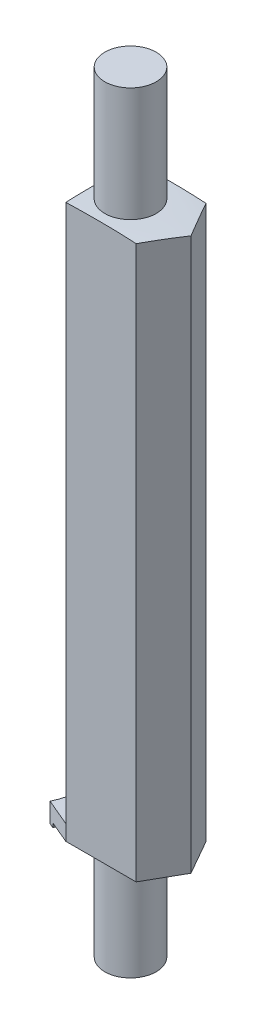
ISO-10303-21;
HEADER;
FILE_DESCRIPTION(('STEP AP214'),'2;1');
FILE_NAME('part.step','',(''),(''),'','','');
FILE_SCHEMA(('AUTOMOTIVE_DESIGN { 1 0 10303 214 1 1 1 1 }'));
ENDSEC;
DATA;
#1=APPLICATION_CONTEXT('core data for automotive mechanical design processes');
#2=APPLICATION_PROTOCOL_DEFINITION('international standard','automotive_design',2000,#1);
#3=PRODUCT_CONTEXT('',#1,'mechanical');
#4=PRODUCT('Part','Part','',(#3));
#5=PRODUCT_RELATED_PRODUCT_CATEGORY('part','',(#4));
#6=PRODUCT_DEFINITION_FORMATION('','',#4);
#7=PRODUCT_DEFINITION_CONTEXT('part definition',#1,'design');
#8=PRODUCT_DEFINITION('design','',#6,#7);
#9=PRODUCT_DEFINITION_SHAPE('','',#8);
#10=(LENGTH_UNIT() NAMED_UNIT(*) SI_UNIT(.MILLI.,.METRE.));
#11=(NAMED_UNIT(*) PLANE_ANGLE_UNIT() SI_UNIT($,.RADIAN.));
#12=(NAMED_UNIT(*) SI_UNIT($,.STERADIAN.) SOLID_ANGLE_UNIT());
#13=UNCERTAINTY_MEASURE_WITH_UNIT(LENGTH_MEASURE(1.E-05),#10,'distance_accuracy_value','');
#14=(GEOMETRIC_REPRESENTATION_CONTEXT(3) GLOBAL_UNCERTAINTY_ASSIGNED_CONTEXT((#13)) GLOBAL_UNIT_ASSIGNED_CONTEXT((#10,
#11,#12)) REPRESENTATION_CONTEXT('',''));
#15=CARTESIAN_POINT('',(0.,0.,0.));
#16=DIRECTION('',(0.,0.,1.));
#17=DIRECTION('',(1.,0.,0.));
#18=AXIS2_PLACEMENT_3D('',#15,#16,#17);
#19=CARTESIAN_POINT('',(20.,44.8,0.));
#20=DIRECTION('',(0.,-1.,0.));
#21=DIRECTION('',(0.,0.,1.));
#22=AXIS2_PLACEMENT_3D('',#19,#20,#21);
#23=DEGENERATE_TOROIDAL_SURFACE('',#22,5.00000000000002,60.,.T.);
#24=CARTESIAN_POINT('',(20.,104.8,0.));
#25=DIRECTION('',(0.,1.,0.));
#26=DIRECTION('',(0.,0.,1.));
#27=AXIS2_PLACEMENT_3D('',#24,#25,#26);
#28=CIRCLE('',#27,5.);
#29=CARTESIAN_POINT('',(20.,104.8,5.));
#30=VERTEX_POINT('',#29);
#31=EDGE_CURVE('E151',#30,#30,#28,.T.);
#32=ORIENTED_EDGE('',*,*,#31,.F.);
#33=EDGE_LOOP('',(#32));
#34=FACE_BOUND('',#33,.T.);
#35=CARTESIAN_POINT('',(27.8838212071915,104.555474179981,-6.80019999999999));
#36=CARTESIAN_POINT('',(28.0457941896187,104.561121031094,-6.51674728075243));
#37=CARTESIAN_POINT('',(28.2077789318126,104.565352827218,-6.23327398191308));
#38=CARTESIAN_POINT('',(28.5317604227324,104.571039735114,-5.66630637280351));
#39=CARTESIAN_POINT('',(28.6937571714561,104.572494847378,-5.382812062537));
#40=CARTESIAN_POINT('',(29.0176986385252,104.5726817848,-4.81591449516604));
#41=CARTESIAN_POINT('',(29.1796433566918,104.571414493732,-4.5325112383744));
#42=CARTESIAN_POINT('',(29.5035212724408,104.566118500035,-3.96572488581374));
#43=CARTESIAN_POINT('',(29.6654544699977,104.562089791506,-3.68234179008911));
#44=CARTESIAN_POINT('',(30.1512357937468,104.545723676592,-2.83222447352814));
#45=CARTESIAN_POINT('',(30.4750535286005,104.529106262098,-2.26554343753426));
#46=CARTESIAN_POINT('',(30.9606603619012,104.494564267379,-1.41573147925796));
#47=CARTESIAN_POINT('',(31.1225362558962,104.48144464164,-1.13244866476677));
#48=CARTESIAN_POINT('',(31.4462123025255,104.451778700995,-0.566015583165492));
#49=CARTESIAN_POINT('',(31.6080124543186,104.435232348894,-0.282865317527622));
#50=CARTESIAN_POINT('',(31.7697640643344,104.416862501227,0.000200000000008369));
#51=B_SPLINE_CURVE_WITH_KNOTS('',3,(#35,#36,#37,#38,#39,#40,#41,#42,#43,#44,#45,#46,#47,#48,#49,
#50),.UNSPECIFIED.,.F.,.F.,(4,2,2,2,2,2,2,4),(0.,0.979543102886018,1.95908603262846,
2.9383110212185,3.91753810231788,5.87606555629242,6.85565516187557,7.83525540119449),.UNSPECIFIED.);
#52=CARTESIAN_POINT('',(27.8839354929058,104.555478172434,-6.79999999999999));
#53=VERTEX_POINT('',#52);
#54=CARTESIAN_POINT('',(31.7696497786201,104.416875478968,0.));
#55=VERTEX_POINT('',#54);
#56=EDGE_CURVE('E134',#53,#55,#51,.T.);
#57=ORIENTED_EDGE('',*,*,#56,.F.);
#58=CARTESIAN_POINT('',(-14.1266769178101,96.8778792534012,-6.79999999999999));
#59=CARTESIAN_POINT('',(-13.439567287965,97.2634572275029,-6.79999999999999));
#60=CARTESIAN_POINT('',(-12.7448509121165,97.63547415688,-6.79999999999999));
#61=CARTESIAN_POINT('',(-11.341332122236,98.3518752687028,-6.79999999999999));
#62=CARTESIAN_POINT('',(-10.6325300115058,98.6962600453363,-6.79999999999999));
#63=CARTESIAN_POINT('',(-9.20072602310979,99.3574623041885,-6.79999999999999));
#64=CARTESIAN_POINT('',(-8.47770212806779,99.6742321065182,-6.79999999999999));
#65=CARTESIAN_POINT('',(-7.0197577715964,100.279122730922,-6.79999999999999));
#66=CARTESIAN_POINT('',(-6.28483715157354,100.567243170709,-6.79999999999999));
#67=CARTESIAN_POINT('',(-4.8034216427448,101.114777537153,-6.79999999999999));
#68=CARTESIAN_POINT('',(-4.05691443945266,101.37415814155,-6.79999999999999));
#69=CARTESIAN_POINT('',(-2.55433046690623,101.863545792174,-6.79999999999999));
#70=CARTESIAN_POINT('',(-1.79825365184214,102.09355269773,-6.79999999999999));
#71=CARTESIAN_POINT('',(-0.27881567119183,102.523695273417,-6.79999999999999));
#72=CARTESIAN_POINT('',(0.484533616937344,102.723872925186,-6.79999999999999));
#73=CARTESIAN_POINT('',(2.01847732229457,103.09470852525,-6.79999999999999));
#74=CARTESIAN_POINT('',(2.78907265889599,103.265362672851,-6.79999999999999));
#75=CARTESIAN_POINT('',(4.19275303627181,103.54832381504,-6.79999999999999));
#76=CARTESIAN_POINT('',(4.824845971847,103.665582492142,-6.79999999999999));
#77=CARTESIAN_POINT('',(6.09233783784132,103.880769735083,-6.79999999999999));
#78=CARTESIAN_POINT('',(6.72773688132083,103.978697635341,-6.79999999999999));
#79=CARTESIAN_POINT('',(8.00110317267348,104.155576573158,-6.79999999999999));
#80=CARTESIAN_POINT('',(8.63907017514263,104.234529382238,-6.79999999999999));
#81=CARTESIAN_POINT('',(9.91698789158442,104.374111666154,-6.79999999999999));
#82=CARTESIAN_POINT('',(10.5569385764941,104.434741408171,-6.79999999999999));
#83=CARTESIAN_POINT('',(11.8402131096525,104.538919221497,-6.79999999999999));
#84=CARTESIAN_POINT('',(12.4835412648381,104.58241375864,-6.79999999999999));
#85=CARTESIAN_POINT('',(13.7710446756716,104.653833317309,-6.79999999999999));
#86=CARTESIAN_POINT('',(14.4152199343998,104.681758282064,-6.79999999999999));
#87=CARTESIAN_POINT('',(15.7041792807653,104.724834940884,-6.79999999999999));
#88=CARTESIAN_POINT('',(16.3489634960587,104.739982621586,-6.79999999999999));
#89=CARTESIAN_POINT('',(17.3162418863635,104.755871361758,-6.79999999999999));
#90=CARTESIAN_POINT('',(17.6386888405984,104.760028820429,-6.79999999999999));
#91=CARTESIAN_POINT('',(18.2836013967416,104.766513119318,-6.79999999999999));
#92=CARTESIAN_POINT('',(18.6060669986334,104.768839961139,-6.79999999999999));
#93=CARTESIAN_POINT('',(19.2512718914033,104.77199563947,-6.79999999999999));
#94=CARTESIAN_POINT('',(19.5740111877768,104.772823233795,-6.79999999999999));
#95=CARTESIAN_POINT('',(20.2194901864245,104.773117550747,-6.79999999999999));
#96=CARTESIAN_POINT('',(20.5422298886985,104.772584274147,-6.79999999999999));
#97=CARTESIAN_POINT('',(21.187703593858,104.770064491567,-6.79999999999999));
#98=CARTESIAN_POINT('',(21.5104375967534,104.768077988432,-6.79999999999999));
#99=CARTESIAN_POINT('',(22.155889850909,104.762353938469,-6.79999999999999));
#100=CARTESIAN_POINT('',(22.4786081021538,104.758616389967,-6.79999999999999));
#101=CARTESIAN_POINT('',(23.446573917848,104.744134835019,-6.79999999999999));
#102=CARTESIAN_POINT('',(24.0917809576822,104.730121704431,-6.79999999999999));
#103=CARTESIAN_POINT('',(25.3818088999992,104.68965124975,-6.79999999999999));
#104=CARTESIAN_POINT('',(26.0266298119497,104.663194244431,-6.79999999999999));
#105=CARTESIAN_POINT('',(27.313739895481,104.595013126357,-6.79999999999999));
#106=CARTESIAN_POINT('',(27.9560312053217,104.553330373935,-6.79999999999999));
#107=CARTESIAN_POINT('',(29.2392679514123,104.452829370198,-6.79999999999999));
#108=CARTESIAN_POINT('',(29.8802134210313,104.394011548912,-6.79999999999999));
#109=CARTESIAN_POINT('',(31.1601529896653,104.25809746962,-6.79999999999999));
#110=CARTESIAN_POINT('',(31.7991471567072,104.181001856362,-6.79999999999999));
#111=CARTESIAN_POINT('',(33.0745398506483,104.007858312183,-6.79999999999999));
#112=CARTESIAN_POINT('',(33.710938440851,103.911810846334,-6.79999999999999));
#113=CARTESIAN_POINT('',(35.3110498843804,103.645301097051,-6.79999999999999));
#114=CARTESIAN_POINT('',(36.2726802206878,103.462129876376,-6.79999999999999));
#115=CARTESIAN_POINT('',(38.1861630534143,103.050396734862,-6.79999999999999));
#116=CARTESIAN_POINT('',(39.1380155142316,102.821834648813,-6.79999999999999));
#117=CARTESIAN_POINT('',(41.0309261257915,102.318944094873,-6.79999999999999));
#118=CARTESIAN_POINT('',(41.971968198532,102.044555033804,-6.79999999999999));
#119=CARTESIAN_POINT('',(43.8396521360281,101.450526081452,-6.79999999999999));
#120=CARTESIAN_POINT('',(44.7662941517585,101.130886664944,-6.79999999999999));
#121=CARTESIAN_POINT('',(46.6012336961362,100.447526513613,-6.79999999999999));
#122=CARTESIAN_POINT('',(47.5095619389772,100.083888266418,-6.79999999999999));
#123=CARTESIAN_POINT('',(49.3074288504148,99.3127857222741,-6.79999999999999));
#124=CARTESIAN_POINT('',(50.1969674305138,98.9053212189622,-6.79999999999999));
#125=CARTESIAN_POINT('',(51.9540931294548,98.0479212559872,-6.79999999999999));
#126=CARTESIAN_POINT('',(52.8217039001253,97.5980342707812,-6.79999999999999));
#127=CARTESIAN_POINT('',(54.5339294818032,96.656431541168,-6.79999999999999));
#128=CARTESIAN_POINT('',(55.3785441310246,96.1647155025786,-6.79999999999999));
#129=CARTESIAN_POINT('',(56.2106124107159,95.6526029010278,-6.79999999999999));
#130=B_SPLINE_CURVE_WITH_KNOTS('',3,(#58,#59,#60,#61,#62,#63,#64,#65,#66,#67,#68,#69,#70,#71,
#72,#73,#74,#75,#76,#77,#78,#79,#80,#81,#82,#83,#84,#85,#86,#87,#88,#89,#90,#91,#92,#93,#94,#95,
#96,#97,#98,#99,#100,#101,#102,#103,#104,#105,#106,#107,#108,#109,#110,#111,#112,#113,#114,#115,
#116,#117,#118,#119,#120,#121,#122,#123,#124,#125,#126,#127,#128,#129),.UNSPECIFIED.,.F.,.F.,(4,
2,2,2,2,2,2,2,2,2,2,2,2,2,2,2,2,2,2,2,2,2,2,2,2,2,2,2,2,2,2,2,2,2,2,4),(0.,2.36354980411509,
4.7270487700304,7.09455089725866,9.46208461133737,11.8323352437465,14.2025972268565,
16.5694911446668,18.9366895370418,20.8650298341745,22.7934365147732,24.7216630888199,
26.6498615446884,28.5840372319726,30.5182199719489,32.4530100155051,33.4204279131898,
34.3878449647025,35.3560631932263,36.3242808707662,37.2924966520038,38.2607133589644,
40.1967015600503,42.1326401697493,44.0633584949068,45.9940283701944,47.924630151446,
49.8551845623256,52.7908017308936,55.7264295844009,58.6659701565363,61.6054798887818,
64.5395617095678,67.4736573465572,70.4044400260237,73.3352433192804),.UNSPECIFIED.);
#131=CARTESIAN_POINT('',(14.2,104.670657353047,-6.79999999999999));
#132=VERTEX_POINT('',#131);
#133=EDGE_CURVE('E189',#132,#53,#130,.T.);
#134=ORIENTED_EDGE('',*,*,#133,.F.);
#135=CARTESIAN_POINT('',(14.2,96.4327480000836,35.0862248886482));
#136=CARTESIAN_POINT('',(14.2,96.8456879503557,34.3791505478219));
#137=CARTESIAN_POINT('',(14.2,97.244123355723,33.6636079524742));
#138=CARTESIAN_POINT('',(14.2,98.0113852069567,32.2168223578096));
#139=CARTESIAN_POINT('',(14.2,98.3802117247124,31.4855793966179));
#140=CARTESIAN_POINT('',(14.2,99.0876009897091,30.0087446307484));
#141=CARTESIAN_POINT('',(14.2,99.426168600111,29.2631551553119));
#142=CARTESIAN_POINT('',(14.2,100.072585614977,27.7587816245932));
#143=CARTESIAN_POINT('',(14.2,100.380435197119,26.9999976456601));
#144=CARTESIAN_POINT('',(14.2,100.959045920801,25.4860035111701));
#145=CARTESIAN_POINT('',(14.2,101.230431722451,24.7310319765828));
#146=CARTESIAN_POINT('',(14.2,101.742930267352,23.2108827810412));
#147=CARTESIAN_POINT('',(14.2,101.984043015142,22.4457051216169));
#148=CARTESIAN_POINT('',(14.2,102.435740616728,20.9063510304531));
#149=CARTESIAN_POINT('',(14.2,102.646323839268,20.1321741202503));
#150=CARTESIAN_POINT('',(14.2,103.036769887549,18.5761971266925));
#151=CARTESIAN_POINT('',(14.2,103.216635990027,17.7943978658653));
#152=CARTESIAN_POINT('',(14.2,103.526378422476,16.3164231600804));
#153=CARTESIAN_POINT('',(14.2,103.659643242939,15.6209550334072));
#154=CARTESIAN_POINT('',(14.2,103.902390398082,14.2258896870959));
#155=CARTESIAN_POINT('',(14.2,104.011873065007,13.5262925252822));
#156=CARTESIAN_POINT('',(14.2,104.207362368725,12.124185120527));
#157=CARTESIAN_POINT('',(14.2,104.293380447022,11.421676467509));
#158=CARTESIAN_POINT('',(14.2,104.442707032262,10.0142581131481));
#159=CARTESIAN_POINT('',(14.2,104.506015794038,9.30934843883796));
#160=CARTESIAN_POINT('',(14.2,104.585203475028,8.24790829414967));
#161=CARTESIAN_POINT('',(14.2,104.60903489748,7.89194897359827));
#162=CARTESIAN_POINT('',(14.2,104.651572518675,7.1797245416256));
#163=CARTESIAN_POINT('',(14.2,104.670278751484,6.82345943225259));
#164=CARTESIAN_POINT('',(14.2,104.702946001791,6.11071798501859));
#165=CARTESIAN_POINT('',(14.2,104.716907063028,5.75424164913491));
#166=CARTESIAN_POINT('',(14.2,104.740602185056,5.04115037055108));
#167=CARTESIAN_POINT('',(14.2,104.750336242859,4.68453542775314));
#168=CARTESIAN_POINT('',(14.2,104.766258670581,3.97086362511485));
#169=CARTESIAN_POINT('',(14.2,104.772443399544,3.61380668668638));
#170=CARTESIAN_POINT('',(14.2,104.782074540209,2.89965479852906));
#171=CARTESIAN_POINT('',(14.2,104.785520926553,2.54255984847885));
#172=CARTESIAN_POINT('',(14.2,104.790553548804,1.82832467689949));
#173=CARTESIAN_POINT('',(14.2,104.79213960956,1.47118445427323));
#174=CARTESIAN_POINT('',(14.2,104.794178353973,0.756902401529298));
#175=CARTESIAN_POINT('',(14.2,104.794631040887,0.399760571419202));
#176=CARTESIAN_POINT('',(14.2,104.794691868657,-0.252604415218402));
#177=CARTESIAN_POINT('',(14.2,104.794432824207,-0.547827543729262));
#178=CARTESIAN_POINT('',(14.2,104.793212629506,-1.13827206085319));
#179=CARTESIAN_POINT('',(14.2,104.7922514792,-1.43349344946611));
#180=CARTESIAN_POINT('',(14.2,104.787819717835,-2.3191548676857));
#181=CARTESIAN_POINT('',(14.2,104.782800793559,-2.9095907558331));
#182=CARTESIAN_POINT('',(14.2,104.764725861247,-4.09026818613301));
#183=CARTESIAN_POINT('',(14.2,104.751671059618,-4.68050974415419));
#184=CARTESIAN_POINT('',(14.2,104.714108862093,-5.86063506315192));
#185=CARTESIAN_POINT('',(14.2,104.689601692292,-6.45051883096186));
#186=CARTESIAN_POINT('',(14.2,104.626988006051,-7.62880487028693));
#187=CARTESIAN_POINT('',(14.2,104.588899296655,-8.21720807048967));
#188=CARTESIAN_POINT('',(14.2,104.497801682804,-9.39285581760336));
#189=CARTESIAN_POINT('',(14.2,104.444793031902,-9.98010038403357));
#190=CARTESIAN_POINT('',(14.2,104.323069937727,-11.1530404302648));
#191=CARTESIAN_POINT('',(14.2,104.254353636737,-11.7387357185405));
#192=CARTESIAN_POINT('',(14.2,104.100773568306,-12.9079885438856));
#193=CARTESIAN_POINT('',(14.2,104.015909850328,-13.4915460874977));
#194=CARTESIAN_POINT('',(14.2,103.738379296296,-15.2276122873592));
#195=CARTESIAN_POINT('',(14.2,103.521656345716,-16.3763823846449));
#196=CARTESIAN_POINT('',(14.2,103.022954207653,-18.6597052739648));
#197=CARTESIAN_POINT('',(14.2,102.740970669361,-19.7942571127745));
#198=CARTESIAN_POINT('',(14.2,102.111844654274,-22.0458706557879));
#199=CARTESIAN_POINT('',(14.2,101.764664430532,-23.1629218196556));
#200=CARTESIAN_POINT('',(14.2,101.006111020222,-25.3747666688916));
#201=CARTESIAN_POINT('',(14.2,100.594753870739,-26.4695658377375));
#202=CARTESIAN_POINT('',(14.2,99.8870461063589,-28.1984139703962));
#203=CARTESIAN_POINT('',(14.2,99.6109110626156,-28.8408165145371));
#204=CARTESIAN_POINT('',(14.2,99.0365961838397,-30.1151662658162));
#205=CARTESIAN_POINT('',(14.2,98.7384321302495,-30.7471205683426));
#206=CARTESIAN_POINT('',(14.2,98.1185533483769,-32.0036378614556));
#207=CARTESIAN_POINT('',(14.2,97.7967194877437,-32.6281420535616));
#208=CARTESIAN_POINT('',(14.2,97.1310794784678,-33.8659239308611));
#209=CARTESIAN_POINT('',(14.2,96.7872572623694,-34.4791929753923));
#210=CARTESIAN_POINT('',(14.2,96.4327480000836,-35.0862248886482));
#211=B_SPLINE_CURVE_WITH_KNOTS('',3,(#135,#136,#137,#138,#139,#140,#141,#142,#143,#144,#145,
#146,#147,#148,#149,#150,#151,#152,#153,#154,#155,#156,#157,#158,#159,#160,#161,#162,#163,#164,
#165,#166,#167,#168,#169,#170,#171,#172,#173,#174,#175,#176,#177,#178,#179,#180,#181,#182,#183,
#184,#185,#186,#187,#188,#189,#190,#191,#192,#193,#194,#195,#196,#197,#198,#199,#200,#201,#202,
#203,#204,#205,#206,#207,#208,#209,#210),.UNSPECIFIED.,.F.,.F.,(4,2,2,2,2,2,2,2,2,2,2,2,2,2,2,2,
2,2,2,2,2,2,2,2,2,2,2,2,2,2,2,2,2,2,2,2,2,4),(0.,2.45629857121721,4.91259117845715,
7.36848830186721,9.82437121913206,12.2305367946567,14.6367020094487,17.0429957433498,
19.4490326264245,21.5729893535357,23.6969164063466,25.819805958099,27.9426716870116,
29.012909635545,30.0831404704033,31.1533614401943,32.2235831664014,33.2949007887511,
34.3662283315174,35.4376567311716,36.5090820503371,37.3947508936383,38.2804198071844,
40.0517618157607,41.8228379618774,43.5938791445443,45.3626067646393,47.131304328478,
48.9002111816009,50.6691126163163,54.1741860199497,57.6794931679725,61.1868360770607,
64.6933039407108,66.790639362139,68.8864865689765,70.9937187171491,73.1025086681529),.UNSPECIFIED.);
#212=CARTESIAN_POINT('',(14.2,104.670657353047,6.80000000000001));
#213=VERTEX_POINT('',#212);
#214=EDGE_CURVE('E197',#213,#132,#211,.T.);
#215=ORIENTED_EDGE('',*,*,#214,.F.);
#216=CARTESIAN_POINT('',(56.2106124107159,95.6526029010278,6.80000000000001));
#217=CARTESIAN_POINT('',(55.4842585146358,96.0996432822907,6.80000000000001));
#218=CARTESIAN_POINT('',(54.7483470684833,96.5311488187417,6.80000000000001));
#219=CARTESIAN_POINT('',(53.2587975161483,97.3623874635332,6.80000000000001));
#220=CARTESIAN_POINT('',(52.5051594891078,97.762120713689,6.80000000000001));
#221=CARTESIAN_POINT('',(50.9816473119445,98.5290613782329,6.80000000000001));
#222=CARTESIAN_POINT('',(50.2117754918115,98.8962734214819,6.80000000000001));
#223=CARTESIAN_POINT('',(48.6571185257422,99.597628053035,6.80000000000001));
#224=CARTESIAN_POINT('',(47.8723334686112,99.9317708381863,6.80000000000001));
#225=CARTESIAN_POINT('',(46.305300541182,100.560045740076,6.80000000000001));
#226=CARTESIAN_POINT('',(45.5233220751267,100.854850120863,6.80000000000001));
#227=CARTESIAN_POINT('',(43.9478219002286,101.411805803199,6.80000000000001));
#228=CARTESIAN_POINT('',(43.1543001881253,101.673957095525,6.80000000000001));
#229=CARTESIAN_POINT('',(41.5571563491499,102.165297446576,6.80000000000001));
#230=CARTESIAN_POINT('',(40.7535346293878,102.394487829282,6.80000000000001));
#231=CARTESIAN_POINT('',(39.1375923052763,102.819752044519,6.80000000000001));
#232=CARTESIAN_POINT('',(38.3252718933924,103.01582660816,6.80000000000001));
#233=CARTESIAN_POINT('',(36.7967666944529,103.352137679342,6.80000000000001));
#234=CARTESIAN_POINT('',(36.0814422957731,103.496301343418,6.80000000000001));
#235=CARTESIAN_POINT('',(34.6462133276919,103.759584076744,6.80000000000001));
#236=CARTESIAN_POINT('',(33.9263088442663,103.878703614693,6.80000000000001));
#237=CARTESIAN_POINT('',(32.4831733976591,104.092283548284,6.80000000000001));
#238=CARTESIAN_POINT('',(31.7599439794899,104.186754410189,6.80000000000001));
#239=CARTESIAN_POINT('',(30.3107960318166,104.35193404557,6.80000000000001));
#240=CARTESIAN_POINT('',(29.5848775190298,104.422642966516,6.80000000000001));
#241=CARTESIAN_POINT('',(28.1254006870469,104.542257100676,6.80000000000001));
#242=CARTESIAN_POINT('',(27.3918277751956,104.590982973366,6.80000000000001));
#243=CARTESIAN_POINT('',(26.290720667109,104.649150039575,6.80000000000001));
#244=CARTESIAN_POINT('',(25.9235577220714,104.666052171781,6.80000000000001));
#245=CARTESIAN_POINT('',(25.1890526683003,104.695397577171,6.80000000000001));
#246=CARTESIAN_POINT('',(24.821710559394,104.707840846041,6.80000000000001));
#247=CARTESIAN_POINT('',(23.7188469490961,104.739402301968,6.80000000000001));
#248=CARTESIAN_POINT('',(22.983160796511,104.752718734749,6.80000000000001));
#249=CARTESIAN_POINT('',(21.8795411667948,104.765206338581,6.80000000000001));
#250=CARTESIAN_POINT('',(21.5116346558235,104.76812099119,6.80000000000001));
#251=CARTESIAN_POINT('',(20.7758105884016,104.7719812256,6.80000000000001));
#252=CARTESIAN_POINT('',(20.407893031984,104.772926812806,6.80000000000001));
#253=CARTESIAN_POINT('',(19.7505596571218,104.773040411709,6.80000000000001));
#254=CARTESIAN_POINT('',(19.4611437394662,104.772544650333,6.80000000000001));
#255=CARTESIAN_POINT('',(18.8823163067571,104.770384216391,6.80000000000001));
#256=CARTESIAN_POINT('',(18.5929047917059,104.768719543252,6.80000000000001));
#257=CARTESIAN_POINT('',(17.7246828212212,104.761687658522,6.80000000000001));
#258=CARTESIAN_POINT('',(17.1458853304748,104.754282581118,6.80000000000001));
#259=CARTESIAN_POINT('',(15.9884940493404,104.731486751865,6.80000000000001));
#260=CARTESIAN_POINT('',(15.4099002442982,104.716096805252,6.80000000000001));
#261=CARTESIAN_POINT('',(14.2530858540255,104.674709785829,6.80000000000001));
#262=CARTESIAN_POINT('',(13.6748652635985,104.648712864046,6.80000000000001));
#263=CARTESIAN_POINT('',(12.5197142889549,104.584194091839,6.80000000000001));
#264=CARTESIAN_POINT('',(11.9427831883536,104.545685291665,6.80000000000001));
#265=CARTESIAN_POINT('',(10.7900144956756,104.454824957822,6.80000000000001));
#266=CARTESIAN_POINT('',(10.2141768850555,104.402473661044,6.80000000000001));
#267=CARTESIAN_POINT('',(9.06398845234473,104.283079838816,6.80000000000001));
#268=CARTESIAN_POINT('',(8.48963770200167,104.216036617311,6.80000000000001));
#269=CARTESIAN_POINT('',(7.3429305633131,104.066738694476,6.80000000000001));
#270=CARTESIAN_POINT('',(6.77057417265279,103.984484010807,6.80000000000001));
#271=CARTESIAN_POINT('',(5.06677327611978,103.715886072076,6.80000000000001));
#272=CARTESIAN_POINT('',(3.93882794757242,103.506707695985,6.80000000000001));
#273=CARTESIAN_POINT('',(1.69623138250708,103.02598668545,6.80000000000001));
#274=CARTESIAN_POINT('',(0.581581374591938,102.75443833373,6.80000000000001));
#275=CARTESIAN_POINT('',(-1.63093552323689,102.148912217021,6.80000000000001));
#276=CARTESIAN_POINT('',(-2.72879824263852,101.814919202814,6.80000000000001));
#277=CARTESIAN_POINT('',(-4.90357098898452,101.085190409829,6.80000000000001));
#278=CARTESIAN_POINT('',(-5.98048621208813,100.68947016834,6.80000000000001));
#279=CARTESIAN_POINT('',(-7.65169873372842,100.020668041514,6.80000000000001));
#280=CARTESIAN_POINT('',(-8.25427969512168,99.7680794271873,6.80000000000001));
#281=CARTESIAN_POINT('',(-9.4505716336618,99.24355967859,6.80000000000001));
#282=CARTESIAN_POINT('',(-10.0442875203155,98.9716397701773,6.80000000000001));
#283=CARTESIAN_POINT('',(-11.2251406217116,98.4073505884139,6.80000000000001));
#284=CARTESIAN_POINT('',(-11.8122371698376,98.1148962567467,6.80000000000001));
#285=CARTESIAN_POINT('',(-12.9768762130423,97.510729546206,6.80000000000001));
#286=CARTESIAN_POINT('',(-13.5544128602767,97.199005894735,6.80000000000001));
#287=CARTESIAN_POINT('',(-14.1266769178101,96.8778792534012,6.80000000000001));
#288=B_SPLINE_CURVE_WITH_KNOTS('',3,(#216,#217,#218,#219,#220,#221,#222,#223,#224,#225,#226,
#227,#228,#229,#230,#231,#232,#233,#234,#235,#236,#237,#238,#239,#240,#241,#242,#243,#244,#245,
#246,#247,#248,#249,#250,#251,#252,#253,#254,#255,#256,#257,#258,#259,#260,#261,#262,#263,#264,
#265,#266,#267,#268,#269,#270,#271,#272,#273,#274,#275,#276,#277,#278,#279,#280,#281,#282,#283,
#284,#285,#286,#287),.UNSPECIFIED.,.F.,.F.,(4,2,2,2,2,2,2,2,2,2,2,2,2,2,2,2,2,2,2,2,2,2,2,2,2,2,
2,2,2,2,2,2,2,2,2,4),(0.,2.55849555230917,5.11697968415346,7.67509907047945,10.2332032284975,
12.7395958346859,15.2459891488617,17.7522817575678,20.2585190266415,22.4472004581805,
24.6358409250603,26.8235505385821,29.0112465745103,31.2164809474291,32.3191138480632,
33.4217478154253,35.629035663659,36.7327889886615,37.8365392836126,38.7047862661784,
39.5730336753401,41.3095296636826,43.0458505686761,44.7821467518806,46.5166377107242,
48.2510989887304,49.9856424577163,51.7201839127958,55.1598442904846,58.5998200977231,
62.0406370595774,65.4805893307202,67.4404287792574,69.3991392840823,71.3665056025697,
73.3350339313827),.UNSPECIFIED.);
#289=CARTESIAN_POINT('',(27.8839354929058,104.555478172434,6.80000000000001));
#290=VERTEX_POINT('',#289);
#291=EDGE_CURVE('E229',#290,#213,#288,.T.);
#292=ORIENTED_EDGE('',*,*,#291,.F.);
#293=CARTESIAN_POINT('',(31.7697640643344,104.416862501227,-0.000199999999993842));
#294=CARTESIAN_POINT('',(31.6080124543186,104.435232348894,0.282865317527637));
#295=CARTESIAN_POINT('',(31.4462123025255,104.451778700995,0.566015583165507));
#296=CARTESIAN_POINT('',(31.1225362558962,104.48144464164,1.13244866476679));
#297=CARTESIAN_POINT('',(30.9606603619012,104.494564267379,1.41573147925798));
#298=CARTESIAN_POINT('',(30.4750535286005,104.529106262098,2.26554343753427));
#299=CARTESIAN_POINT('',(30.1512357937468,104.545723676592,2.83222447352816));
#300=CARTESIAN_POINT('',(29.6654544699977,104.562089791506,3.68234179008912));
#301=CARTESIAN_POINT('',(29.5035212724408,104.566118500035,3.96572488581376));
#302=CARTESIAN_POINT('',(29.1796433566918,104.571414493732,4.53251123837441));
#303=CARTESIAN_POINT('',(29.0176986385252,104.5726817848,4.81591449516606));
#304=CARTESIAN_POINT('',(28.6937571714561,104.572494847378,5.38281206253702));
#305=CARTESIAN_POINT('',(28.5317604227324,104.571039735114,5.66630637280353));
#306=CARTESIAN_POINT('',(28.2077789318126,104.565352827218,6.2332739819131));
#307=CARTESIAN_POINT('',(28.0457941896187,104.561121031094,6.51674728075245));
#308=CARTESIAN_POINT('',(27.8838212071915,104.555474179981,6.80020000000001));
#309=B_SPLINE_CURVE_WITH_KNOTS('',3,(#293,#294,#295,#296,#297,#298,#299,#300,#301,#302,#303,
#304,#305,#306,#307,#308),.UNSPECIFIED.,.F.,.F.,(4,2,2,2,2,2,2,4),(0.,0.979600239318917,
1.95918984490207,3.91771729887662,4.89694437997599,5.87616936856604,6.85571229830848,
7.83525540119449),.UNSPECIFIED.);
#310=EDGE_CURVE('E224',#55,#290,#309,.T.);
#311=ORIENTED_EDGE('',*,*,#310,.F.);
#312=EDGE_LOOP('',(#57,#134,#215,#292,#311));
#313=FACE_BOUND('',#312,.T.);
#314=ADVANCED_FACE('F41',(#34,#313),#23,.T.);
#315=CARTESIAN_POINT('',(31.7696497786201,104.802,0.));
#316=DIRECTION('',(0.868243142124459,0.,0.496138938356833));
#317=DIRECTION('',(0.496138938356833,0.,-0.868243142124459));
#318=AXIS2_PLACEMENT_3D('',#315,#316,#317);
#319=PLANE('',#318);
#320=DIRECTION('',(0.,-1.,0.));
#321=VECTOR('',#320,1.);
#322=CARTESIAN_POINT('',(31.7696497786201,104.802,0.));
#323=LINE('',#322,#321);
#324=CARTESIAN_POINT('',(31.7696497786201,-3.,0.));
#325=VERTEX_POINT('',#324);
#326=EDGE_CURVE('E196',#55,#325,#323,.T.);
#327=ORIENTED_EDGE('',*,*,#326,.F.);
#328=ORIENTED_EDGE('',*,*,#310,.T.);
#329=DIRECTION('',(0.,-1.,0.));
#330=VECTOR('',#329,1.);
#331=CARTESIAN_POINT('',(27.8839354929058,104.802,6.80000000000001));
#332=LINE('',#331,#330);
#333=CARTESIAN_POINT('',(27.8839354929058,-3.,6.80000000000001));
#334=VERTEX_POINT('',#333);
#335=EDGE_CURVE('E260',#290,#334,#332,.T.);
#336=ORIENTED_EDGE('',*,*,#335,.T.);
#337=DIRECTION('',(-0.496138938356833,0.,0.868243142124459));
#338=VECTOR('',#337,1.);
#339=CARTESIAN_POINT('',(31.7696497786201,-3.,0.));
#340=LINE('',#339,#338);
#341=EDGE_CURVE('E171',#325,#334,#340,.T.);
#342=ORIENTED_EDGE('',*,*,#341,.F.);
#343=EDGE_LOOP('',(#327,#328,#336,#342));
#344=FACE_BOUND('',#343,.T.);
#345=ADVANCED_FACE('F207',(#344),#319,.T.);
#346=CARTESIAN_POINT('',(27.8839354929058,104.802,6.80000000000001));
#347=DIRECTION('',(0.,0.,1.));
#348=DIRECTION('',(1.,0.,0.));
#349=AXIS2_PLACEMENT_3D('',#346,#347,#348);
#350=PLANE('',#349);
#351=ORIENTED_EDGE('',*,*,#335,.F.);
#352=ORIENTED_EDGE('',*,*,#291,.T.);
#353=DIRECTION('',(0.,-1.,0.));
#354=VECTOR('',#353,1.);
#355=CARTESIAN_POINT('',(14.2,104.802,6.80000000000001));
#356=LINE('',#355,#354);
#357=CARTESIAN_POINT('',(14.2,0.,6.80000000000001));
#358=VERTEX_POINT('',#357);
#359=EDGE_CURVE('E67',#213,#358,#356,.T.);
#360=ORIENTED_EDGE('',*,*,#359,.T.);
#361=DIRECTION('',(0.,1.,0.));
#362=VECTOR('',#361,1.);
#363=CARTESIAN_POINT('',(14.2,-3.,6.80000000000001));
#364=LINE('',#363,#362);
#365=CARTESIAN_POINT('',(14.2,-3.,6.80000000000001));
#366=VERTEX_POINT('',#365);
#367=EDGE_CURVE('E184',#366,#358,#364,.T.);
#368=ORIENTED_EDGE('',*,*,#367,.F.);
#369=DIRECTION('',(-1.,0.,0.));
#370=VECTOR('',#369,1.);
#371=CARTESIAN_POINT('',(27.8839354929058,-3.,6.80000000000001));
#372=LINE('',#371,#370);
#373=EDGE_CURVE('E174',#334,#366,#372,.T.);
#374=ORIENTED_EDGE('',*,*,#373,.F.);
#375=EDGE_LOOP('',(#351,#352,#360,#368,#374));
#376=FACE_BOUND('',#375,.T.);
#377=ADVANCED_FACE('F235',(#376),#350,.T.);
#378=CARTESIAN_POINT('',(27.8839354929058,104.802,-6.79999999999999));
#379=DIRECTION('',(0.868243142124459,0.,-0.496138938356834));
#380=DIRECTION('',(-0.496138938356834,0.,-0.868243142124459));
#381=AXIS2_PLACEMENT_3D('',#378,#379,#380);
#382=PLANE('',#381);
#383=DIRECTION('',(0.,-1.,0.));
#384=VECTOR('',#383,1.);
#385=CARTESIAN_POINT('',(27.8839354929058,104.802,-6.79999999999999));
#386=LINE('',#385,#384);
#387=CARTESIAN_POINT('',(27.8839354929058,-3.,-6.79999999999999));
#388=VERTEX_POINT('',#387);
#389=EDGE_CURVE('E51',#53,#388,#386,.T.);
#390=ORIENTED_EDGE('',*,*,#389,.F.);
#391=ORIENTED_EDGE('',*,*,#56,.T.);
#392=ORIENTED_EDGE('',*,*,#326,.T.);
#393=DIRECTION('',(0.496138938356834,0.,0.868243142124459));
#394=VECTOR('',#393,1.);
#395=CARTESIAN_POINT('',(27.8839354929058,-3.,-6.79999999999999));
#396=LINE('',#395,#394);
#397=EDGE_CURVE('E168',#388,#325,#396,.T.);
#398=ORIENTED_EDGE('',*,*,#397,.F.);
#399=EDGE_LOOP('',(#390,#391,#392,#398));
#400=FACE_BOUND('',#399,.T.);
#401=ADVANCED_FACE('F210',(#400),#382,.T.);
#402=CARTESIAN_POINT('',(14.2,104.802,6.80000000000001));
#403=DIRECTION('',(-1.,0.,0.));
#404=DIRECTION('',(0.,0.,1.));
#405=AXIS2_PLACEMENT_3D('',#402,#403,#404);
#406=PLANE('',#405);
#407=ORIENTED_EDGE('',*,*,#359,.F.);
#408=ORIENTED_EDGE('',*,*,#214,.T.);
#409=DIRECTION('',(0.,-1.,0.));
#410=VECTOR('',#409,1.);
#411=CARTESIAN_POINT('',(14.2,104.802,-6.79999999999999));
#412=LINE('',#411,#410);
#413=CARTESIAN_POINT('',(14.2,0.,-6.79999999999999));
#414=VERTEX_POINT('',#413);
#415=EDGE_CURVE('E264',#132,#414,#412,.T.);
#416=ORIENTED_EDGE('',*,*,#415,.T.);
#417=DIRECTION('',(0.,0.,-1.));
#418=VECTOR('',#417,1.);
#419=CARTESIAN_POINT('',(14.2,0.,6.80000000000001));
#420=LINE('',#419,#418);
#421=EDGE_CURVE('E11',#358,#414,#420,.T.);
#422=ORIENTED_EDGE('',*,*,#421,.F.);
#423=EDGE_LOOP('',(#407,#408,#416,#422));
#424=FACE_BOUND('',#423,.T.);
#425=ADVANCED_FACE('F239',(#424),#406,.T.);
#426=CARTESIAN_POINT('',(14.2,104.802,-6.79999999999999));
#427=DIRECTION('',(0.,0.,-1.));
#428=DIRECTION('',(-1.,0.,0.));
#429=AXIS2_PLACEMENT_3D('',#426,#427,#428);
#430=PLANE('',#429);
#431=ORIENTED_EDGE('',*,*,#415,.F.);
#432=ORIENTED_EDGE('',*,*,#133,.T.);
#433=ORIENTED_EDGE('',*,*,#389,.T.);
#434=DIRECTION('',(1.,0.,0.));
#435=VECTOR('',#434,1.);
#436=CARTESIAN_POINT('',(14.2,-3.,-6.79999999999999));
#437=LINE('',#436,#435);
#438=CARTESIAN_POINT('',(14.2,-3.,-6.79999999999999));
#439=VERTEX_POINT('',#438);
#440=EDGE_CURVE('E164',#439,#388,#437,.T.);
#441=ORIENTED_EDGE('',*,*,#440,.F.);
#442=DIRECTION('',(0.,1.,0.));
#443=VECTOR('',#442,1.);
#444=CARTESIAN_POINT('',(14.2,-3.,-6.79999999999999));
#445=LINE('',#444,#443);
#446=EDGE_CURVE('E135',#439,#414,#445,.T.);
#447=ORIENTED_EDGE('',*,*,#446,.T.);
#448=EDGE_LOOP('',(#431,#432,#433,#441,#447));
#449=FACE_BOUND('',#448,.T.);
#450=ADVANCED_FACE('F43',(#449),#430,.T.);
#451=CARTESIAN_POINT('',(0.,-3.,0.));
#452=DIRECTION('',(0.,1.,0.));
#453=DIRECTION('',(0.,0.,1.));
#454=AXIS2_PLACEMENT_3D('',#451,#452,#453);
#455=CYLINDRICAL_SURFACE('',#454,10.);
#456=CARTESIAN_POINT('',(0.,0.,0.));
#457=DIRECTION('',(0.,1.,0.));
#458=DIRECTION('',(0.,0.,1.));
#459=AXIS2_PLACEMENT_3D('',#456,#457,#458);
#460=CIRCLE('',#459,10.);
#461=CARTESIAN_POINT('',(8.90000000000003,0.,4.5596052460712));
#462=VERTEX_POINT('',#461);
#463=CARTESIAN_POINT('',(8.90000000000003,0.,-4.5596052460712));
#464=VERTEX_POINT('',#463);
#465=EDGE_CURVE('E131',#462,#464,#460,.T.);
#466=ORIENTED_EDGE('',*,*,#465,.T.);
#467=DIRECTION('',(0.,1.,0.));
#468=VECTOR('',#467,1.);
#469=CARTESIAN_POINT('',(8.90000000000003,-3.,-4.5596052460712));
#470=LINE('',#469,#468);
#471=CARTESIAN_POINT('',(8.90000000000003,-3.8,-4.5596052460712));
#472=VERTEX_POINT('',#471);
#473=EDGE_CURVE('E124',#472,#464,#470,.T.);
#474=ORIENTED_EDGE('',*,*,#473,.F.);
#475=CARTESIAN_POINT('',(0.,-3.8,0.));
#476=DIRECTION('',(0.,1.,0.));
#477=DIRECTION('',(0.,0.,1.));
#478=AXIS2_PLACEMENT_3D('',#475,#476,#477);
#479=CIRCLE('',#478,10.);
#480=CARTESIAN_POINT('',(8.90000000000003,-3.8,4.5596052460712));
#481=VERTEX_POINT('',#480);
#482=EDGE_CURVE('E129',#481,#472,#479,.T.);
#483=ORIENTED_EDGE('',*,*,#482,.F.);
#484=DIRECTION('',(0.,1.,0.));
#485=VECTOR('',#484,1.);
#486=CARTESIAN_POINT('',(8.90000000000003,-3.,4.5596052460712));
#487=LINE('',#486,#485);
#488=EDGE_CURVE('E178',#481,#462,#487,.T.);
#489=ORIENTED_EDGE('',*,*,#488,.T.);
#490=EDGE_LOOP('',(#466,#474,#483,#489));
#491=FACE_BOUND('',#490,.T.);
#492=ADVANCED_FACE('F126',(#491),#455,.F.);
#493=CARTESIAN_POINT('',(14.2,-3.,-6.79999999999999));
#494=DIRECTION('',(0.38935799543113,0.,0.921086505923223));
#495=DIRECTION('',(0.921086505923223,0.,-0.38935799543113));
#496=AXIS2_PLACEMENT_3D('',#493,#494,#495);
#497=PLANE('',#496);
#498=DIRECTION('',(0.921086505923223,0.,-0.38935799543113));
#499=VECTOR('',#498,1.);
#500=CARTESIAN_POINT('',(14.2,0.,-6.79999999999999));
#501=LINE('',#500,#499);
#502=EDGE_CURVE('E180',#464,#414,#501,.T.);
#503=ORIENTED_EDGE('',*,*,#502,.T.);
#504=ORIENTED_EDGE('',*,*,#446,.F.);
#505=DIRECTION('',(0.921086505923223,0.,-0.38935799543113));
#506=VECTOR('',#505,1.);
#507=CARTESIAN_POINT('',(14.2,-3.,-6.79999999999999));
#508=LINE('',#507,#506);
#509=CARTESIAN_POINT('',(9.82335361749096,-3.,-4.94992158581608));
#510=VERTEX_POINT('',#509);
#511=EDGE_CURVE('E162',#510,#439,#508,.T.);
#512=ORIENTED_EDGE('',*,*,#511,.F.);
#513=DIRECTION('',(0.,1.,0.));
#514=VECTOR('',#513,1.);
#515=CARTESIAN_POINT('',(9.82335361749096,-3.8,-4.94992158581607));
#516=LINE('',#515,#514);
#517=CARTESIAN_POINT('',(9.82335361749096,-3.8,-4.94992158581607));
#518=VERTEX_POINT('',#517);
#519=EDGE_CURVE('E141',#518,#510,#516,.T.);
#520=ORIENTED_EDGE('',*,*,#519,.F.);
#521=DIRECTION('',(0.921086505923224,0.,-0.389357995431129));
#522=VECTOR('',#521,1.);
#523=CARTESIAN_POINT('',(8.90000000000003,-3.8,-4.5596052460712));
#524=LINE('',#523,#522);
#525=EDGE_CURVE('E138',#472,#518,#524,.T.);
#526=ORIENTED_EDGE('',*,*,#525,.F.);
#527=ORIENTED_EDGE('',*,*,#473,.T.);
#528=EDGE_LOOP('',(#503,#504,#512,#520,#526,#527));
#529=FACE_BOUND('',#528,.T.);
#530=ADVANCED_FACE('F139',(#529),#497,.F.);
#531=CARTESIAN_POINT('',(8.90000000000003,-3.,4.5596052460712));
#532=DIRECTION('',(0.389357995431133,0.,-0.921086505923222));
#533=DIRECTION('',(-0.921086505923222,0.,-0.389357995431133));
#534=AXIS2_PLACEMENT_3D('',#531,#532,#533);
#535=PLANE('',#534);
#536=DIRECTION('',(-0.921086505923222,0.,-0.389357995431133));
#537=VECTOR('',#536,1.);
#538=CARTESIAN_POINT('',(8.90000000000003,0.,4.5596052460712));
#539=LINE('',#538,#537);
#540=EDGE_CURVE('E165',#358,#462,#539,.T.);
#541=ORIENTED_EDGE('',*,*,#540,.T.);
#542=ORIENTED_EDGE('',*,*,#488,.F.);
#543=DIRECTION('',(-0.921086505923222,0.,-0.389357995431132));
#544=VECTOR('',#543,1.);
#545=CARTESIAN_POINT('',(8.90000000000003,-3.8,4.5596052460712));
#546=LINE('',#545,#544);
#547=CARTESIAN_POINT('',(9.82335361749096,-3.8,4.94992158581608));
#548=VERTEX_POINT('',#547);
#549=EDGE_CURVE('E149',#548,#481,#546,.T.);
#550=ORIENTED_EDGE('',*,*,#549,.F.);
#551=DIRECTION('',(0.,1.,0.));
#552=VECTOR('',#551,1.);
#553=CARTESIAN_POINT('',(9.82335361749096,-3.8,4.94992158581608));
#554=LINE('',#553,#552);
#555=CARTESIAN_POINT('',(9.82335361749096,-3.,4.94992158581608));
#556=VERTEX_POINT('',#555);
#557=EDGE_CURVE('E157',#548,#556,#554,.T.);
#558=ORIENTED_EDGE('',*,*,#557,.T.);
#559=DIRECTION('',(-0.921086505923222,0.,-0.389357995431133));
#560=VECTOR('',#559,1.);
#561=CARTESIAN_POINT('',(8.90000000000003,-3.,4.5596052460712));
#562=LINE('',#561,#560);
#563=EDGE_CURVE('E176',#366,#556,#562,.T.);
#564=ORIENTED_EDGE('',*,*,#563,.F.);
#565=ORIENTED_EDGE('',*,*,#367,.T.);
#566=EDGE_LOOP('',(#541,#542,#550,#558,#564,#565));
#567=FACE_BOUND('',#566,.T.);
#568=ADVANCED_FACE('F276',(#567),#535,.F.);
#569=CARTESIAN_POINT('',(0.,-3.,0.));
#570=DIRECTION('',(0.,1.,0.));
#571=DIRECTION('',(0.,0.,1.));
#572=AXIS2_PLACEMENT_3D('',#569,#570,#571);
#573=PLANE('',#572);
#574=CARTESIAN_POINT('',(20.,-3.,0.));
#575=DIRECTION('',(0.,1.,0.));
#576=DIRECTION('',(0.,0.,1.));
#577=AXIS2_PLACEMENT_3D('',#574,#575,#576);
#578=CIRCLE('',#577,5.);
#579=CARTESIAN_POINT('',(20.,-3.,5.));
#580=VERTEX_POINT('',#579);
#581=EDGE_CURVE('E46',#580,#580,#578,.T.);
#582=ORIENTED_EDGE('',*,*,#581,.T.);
#583=EDGE_LOOP('',(#582));
#584=FACE_BOUND('',#583,.T.);
#585=CARTESIAN_POINT('',(0.,-3.,0.));
#586=DIRECTION('',(0.,-1.,0.));
#587=DIRECTION('',(0.,0.,1.));
#588=AXIS2_PLACEMENT_3D('',#585,#586,#587);
#589=CIRCLE('',#588,11.);
#590=EDGE_CURVE('E59',#510,#556,#589,.T.);
#591=ORIENTED_EDGE('',*,*,#590,.F.);
#592=ORIENTED_EDGE('',*,*,#511,.T.);
#593=ORIENTED_EDGE('',*,*,#440,.T.);
#594=ORIENTED_EDGE('',*,*,#397,.T.);
#595=ORIENTED_EDGE('',*,*,#341,.T.);
#596=ORIENTED_EDGE('',*,*,#373,.T.);
#597=ORIENTED_EDGE('',*,*,#563,.T.);
#598=EDGE_LOOP('',(#591,#592,#593,#594,#595,#596,#597));
#599=FACE_BOUND('',#598,.T.);
#600=ADVANCED_FACE('F269',(#584,#599),#573,.F.);
#601=CARTESIAN_POINT('',(0.,0.,0.));
#602=DIRECTION('',(0.,1.,0.));
#603=DIRECTION('',(0.,0.,1.));
#604=AXIS2_PLACEMENT_3D('',#601,#602,#603);
#605=PLANE('',#604);
#606=ORIENTED_EDGE('',*,*,#540,.F.);
#607=ORIENTED_EDGE('',*,*,#421,.T.);
#608=ORIENTED_EDGE('',*,*,#502,.F.);
#609=ORIENTED_EDGE('',*,*,#465,.F.);
#610=EDGE_LOOP('',(#606,#607,#608,#609));
#611=FACE_BOUND('',#610,.T.);
#612=ADVANCED_FACE('F274',(#611),#605,.T.);
#613=CARTESIAN_POINT('',(0.,-3.8,0.));
#614=DIRECTION('',(0.,1.,0.));
#615=DIRECTION('',(0.,0.,1.));
#616=AXIS2_PLACEMENT_3D('',#613,#614,#615);
#617=CYLINDRICAL_SURFACE('',#616,11.);
#618=ORIENTED_EDGE('',*,*,#590,.T.);
#619=ORIENTED_EDGE('',*,*,#557,.F.);
#620=CARTESIAN_POINT('',(0.,-3.8,0.));
#621=DIRECTION('',(0.,-1.,0.));
#622=DIRECTION('',(0.,0.,1.));
#623=AXIS2_PLACEMENT_3D('',#620,#621,#622);
#624=CIRCLE('',#623,11.);
#625=EDGE_CURVE('E144',#518,#548,#624,.T.);
#626=ORIENTED_EDGE('',*,*,#625,.F.);
#627=ORIENTED_EDGE('',*,*,#519,.T.);
#628=EDGE_LOOP('',(#618,#619,#626,#627));
#629=FACE_BOUND('',#628,.T.);
#630=ADVANCED_FACE('F281',(#629),#617,.T.);
#631=CARTESIAN_POINT('',(0.,-3.8,0.));
#632=DIRECTION('',(0.,1.,0.));
#633=DIRECTION('',(0.,0.,1.));
#634=AXIS2_PLACEMENT_3D('',#631,#632,#633);
#635=PLANE('',#634);
#636=ORIENTED_EDGE('',*,*,#482,.T.);
#637=ORIENTED_EDGE('',*,*,#525,.T.);
#638=ORIENTED_EDGE('',*,*,#625,.T.);
#639=ORIENTED_EDGE('',*,*,#549,.T.);
#640=EDGE_LOOP('',(#636,#637,#638,#639));
#641=FACE_BOUND('',#640,.T.);
#642=ADVANCED_FACE('F147',(#641),#635,.F.);
#643=CARTESIAN_POINT('',(20.,-23.,0.));
#644=DIRECTION('',(0.,-1.,0.));
#645=DIRECTION('',(0.,0.,-1.));
#646=AXIS2_PLACEMENT_3D('',#643,#644,#645);
#647=PLANE('',#646);
#648=CARTESIAN_POINT('',(20.,-23.,0.));
#649=DIRECTION('',(0.,-1.,0.));
#650=DIRECTION('',(0.,0.,-1.));
#651=AXIS2_PLACEMENT_3D('',#648,#649,#650);
#652=CIRCLE('',#651,5.);
#653=CARTESIAN_POINT('',(20.,-23.,-5.));
#654=VERTEX_POINT('',#653);
#655=EDGE_CURVE('E402',#654,#654,#652,.T.);
#656=ORIENTED_EDGE('',*,*,#655,.T.);
#657=EDGE_LOOP('',(#656));
#658=FACE_BOUND('',#657,.T.);
#659=ADVANCED_FACE('F288',(#658),#647,.T.);
#660=CARTESIAN_POINT('',(20.,127.,0.));
#661=DIRECTION('',(0.,-1.,0.));
#662=DIRECTION('',(0.,0.,-1.));
#663=AXIS2_PLACEMENT_3D('',#660,#661,#662);
#664=CYLINDRICAL_SURFACE('',#663,5.);
#665=ORIENTED_EDGE('',*,*,#655,.F.);
#666=EDGE_LOOP('',(#665));
#667=FACE_BOUND('',#666,.T.);
#668=ORIENTED_EDGE('',*,*,#581,.F.);
#669=EDGE_LOOP('',(#668));
#670=FACE_BOUND('',#669,.T.);
#671=ADVANCED_FACE('F356',(#667,#670),#664,.T.);
#672=ORIENTED_EDGE('',*,*,#31,.T.);
#673=EDGE_LOOP('',(#672));
#674=FACE_BOUND('',#673,.T.);
#675=CARTESIAN_POINT('',(20.,127.,0.));
#676=DIRECTION('',(0.,-1.,0.));
#677=DIRECTION('',(0.,0.,-1.));
#678=AXIS2_PLACEMENT_3D('',#675,#676,#677);
#679=CIRCLE('',#678,5.);
#680=CARTESIAN_POINT('',(20.,127.,-5.));
#681=VERTEX_POINT('',#680);
#682=EDGE_CURVE('E400',#681,#681,#679,.T.);
#683=ORIENTED_EDGE('',*,*,#682,.T.);
#684=EDGE_LOOP('',(#683));
#685=FACE_BOUND('',#684,.T.);
#686=ADVANCED_FACE('F365',(#674,#685),#664,.T.);
#687=CARTESIAN_POINT('',(20.,127.,0.));
#688=DIRECTION('',(0.,-1.,0.));
#689=DIRECTION('',(0.,0.,-1.));
#690=AXIS2_PLACEMENT_3D('',#687,#688,#689);
#691=PLANE('',#690);
#692=ORIENTED_EDGE('',*,*,#682,.F.);
#693=EDGE_LOOP('',(#692));
#694=FACE_BOUND('',#693,.T.);
#695=ADVANCED_FACE('F373',(#694),#691,.F.);
#696=CLOSED_SHELL('',(#314,#345,#377,#401,#425,#450,#492,#530,#568,#600,#612,#630,#642,#659,
#671,#686,#695));
#697=MANIFOLD_SOLID_BREP('B2',#696);
#698=ADVANCED_BREP_SHAPE_REPRESENTATION('',(#18,#697),#14);
#699=SHAPE_DEFINITION_REPRESENTATION(#9,#698);
ENDSEC;
END-ISO-10303-21;
